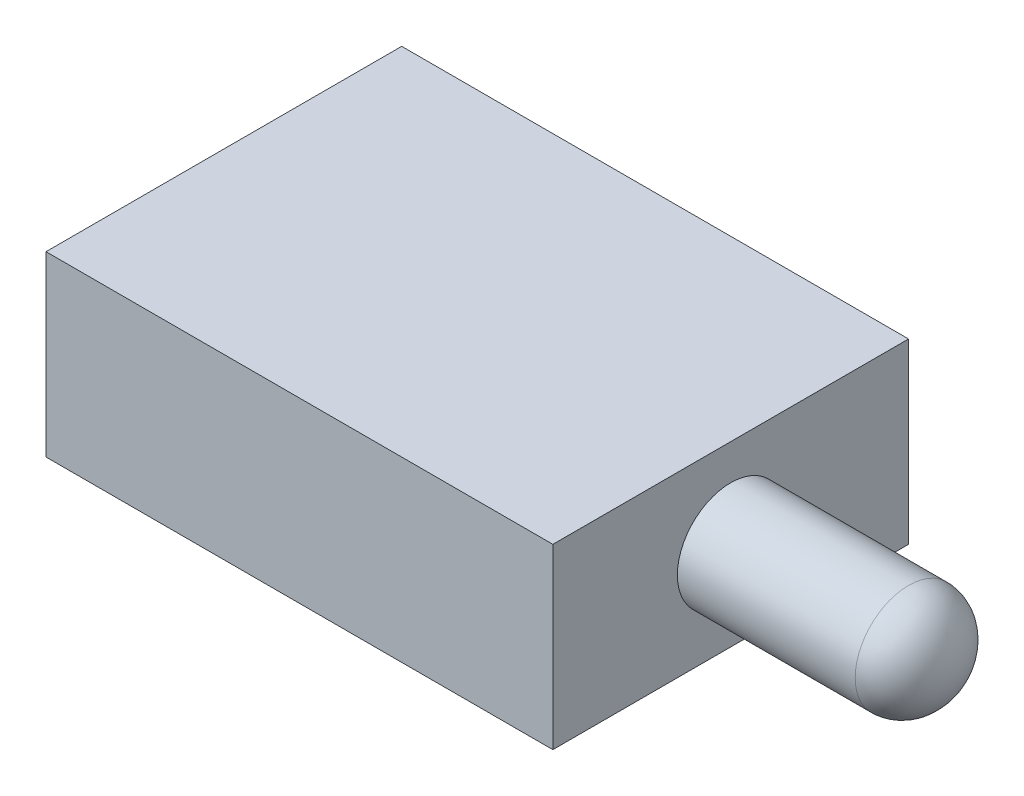
ISO-10303-21;
HEADER;
FILE_DESCRIPTION(('STEP AP214'),'2;1');
FILE_NAME('part.step','',(''),(''),'','','');
FILE_SCHEMA(('AUTOMOTIVE_DESIGN { 1 0 10303 214 1 1 1 1 }'));
ENDSEC;
DATA;
#1=APPLICATION_CONTEXT('core data for automotive mechanical design processes');
#2=APPLICATION_PROTOCOL_DEFINITION('international standard','automotive_design',2000,#1);
#3=PRODUCT_CONTEXT('',#1,'mechanical');
#4=PRODUCT('Part','Part','',(#3));
#5=PRODUCT_RELATED_PRODUCT_CATEGORY('part','',(#4));
#6=PRODUCT_DEFINITION_FORMATION('','',#4);
#7=PRODUCT_DEFINITION_CONTEXT('part definition',#1,'design');
#8=PRODUCT_DEFINITION('design','',#6,#7);
#9=PRODUCT_DEFINITION_SHAPE('','',#8);
#10=(LENGTH_UNIT() NAMED_UNIT(*) SI_UNIT(.MILLI.,.METRE.));
#11=(NAMED_UNIT(*) PLANE_ANGLE_UNIT() SI_UNIT($,.RADIAN.));
#12=(NAMED_UNIT(*) SI_UNIT($,.STERADIAN.) SOLID_ANGLE_UNIT());
#13=UNCERTAINTY_MEASURE_WITH_UNIT(LENGTH_MEASURE(1.E-05),#10,'distance_accuracy_value','');
#14=(GEOMETRIC_REPRESENTATION_CONTEXT(3) GLOBAL_UNCERTAINTY_ASSIGNED_CONTEXT((#13)) GLOBAL_UNIT_ASSIGNED_CONTEXT((#10,
#11,#12)) REPRESENTATION_CONTEXT('',''));
#15=CARTESIAN_POINT('',(0.,0.,0.));
#16=DIRECTION('',(0.,0.,1.));
#17=DIRECTION('',(1.,0.,0.));
#18=AXIS2_PLACEMENT_3D('',#15,#16,#17);
#19=CARTESIAN_POINT('',(0.,0.,0.));
#20=DIRECTION('',(0.,-1.,0.));
#21=DIRECTION('',(0.,0.,-1.));
#22=AXIS2_PLACEMENT_3D('',#19,#20,#21);
#23=PLANE('',#22);
#24=CARTESIAN_POINT('',(4.45,0.,0.));
#25=DIRECTION('',(0.,-1.,0.));
#26=DIRECTION('',(0.,0.,-1.));
#27=AXIS2_PLACEMENT_3D('',#24,#25,#26);
#28=CIRCLE('',#27,0.4);
#29=CARTESIAN_POINT('',(4.45,0.,-0.4));
#30=VERTEX_POINT('',#29);
#31=EDGE_CURVE('E122',#30,#30,#28,.T.);
#32=ORIENTED_EDGE('',*,*,#31,.F.);
#33=EDGE_LOOP('',(#32));
#34=FACE_BOUND('',#33,.T.);
#35=DIRECTION('',(0.,0.,1.));
#36=VECTOR('',#35,1.);
#37=CARTESIAN_POINT('',(0.,0.,2.));
#38=LINE('',#37,#36);
#39=CARTESIAN_POINT('',(0.,0.,-2.));
#40=VERTEX_POINT('',#39);
#41=CARTESIAN_POINT('',(0.,0.,2.));
#42=VERTEX_POINT('',#41);
#43=EDGE_CURVE('E107',#40,#42,#38,.T.);
#44=ORIENTED_EDGE('',*,*,#43,.F.);
#45=DIRECTION('',(-1.,0.,0.));
#46=VECTOR('',#45,1.);
#47=CARTESIAN_POINT('',(0.,0.,-2.));
#48=LINE('',#47,#46);
#49=CARTESIAN_POINT('',(5.7,0.,-2.));
#50=VERTEX_POINT('',#49);
#51=EDGE_CURVE('E75',#50,#40,#48,.T.);
#52=ORIENTED_EDGE('',*,*,#51,.F.);
#53=DIRECTION('',(0.,0.,-1.));
#54=VECTOR('',#53,1.);
#55=CARTESIAN_POINT('',(5.7,0.,2.));
#56=LINE('',#55,#54);
#57=CARTESIAN_POINT('',(5.7,0.,2.));
#58=VERTEX_POINT('',#57);
#59=EDGE_CURVE('E112',#58,#50,#56,.T.);
#60=ORIENTED_EDGE('',*,*,#59,.F.);
#61=DIRECTION('',(1.,0.,0.));
#62=VECTOR('',#61,1.);
#63=CARTESIAN_POINT('',(0.,0.,2.));
#64=LINE('',#63,#62);
#65=EDGE_CURVE('E95',#42,#58,#64,.T.);
#66=ORIENTED_EDGE('',*,*,#65,.F.);
#67=EDGE_LOOP('',(#44,#52,#60,#66));
#68=FACE_BOUND('',#67,.T.);
#69=CARTESIAN_POINT('',(1.45,0.,0.));
#70=DIRECTION('',(0.,-1.,0.));
#71=DIRECTION('',(0.,0.,-1.));
#72=AXIS2_PLACEMENT_3D('',#69,#70,#71);
#73=CIRCLE('',#72,0.4);
#74=CARTESIAN_POINT('',(1.45,0.,-0.4));
#75=VERTEX_POINT('',#74);
#76=EDGE_CURVE('E130',#75,#75,#73,.T.);
#77=ORIENTED_EDGE('',*,*,#76,.F.);
#78=EDGE_LOOP('',(#77));
#79=FACE_BOUND('',#78,.T.);
#80=ADVANCED_FACE('F34',(#34,#68,#79),#23,.T.);
#81=CARTESIAN_POINT('',(5.7,2.,2.));
#82=DIRECTION('',(-1.,0.,0.));
#83=DIRECTION('',(0.,0.,1.));
#84=AXIS2_PLACEMENT_3D('',#81,#82,#83);
#85=PLANE('',#84);
#86=ORIENTED_EDGE('',*,*,#59,.T.);
#87=DIRECTION('',(0.,-1.,0.));
#88=VECTOR('',#87,1.);
#89=CARTESIAN_POINT('',(5.7,2.,-2.));
#90=LINE('',#89,#88);
#91=CARTESIAN_POINT('',(5.7,2.,-2.));
#92=VERTEX_POINT('',#91);
#93=EDGE_CURVE('E98',#92,#50,#90,.T.);
#94=ORIENTED_EDGE('',*,*,#93,.F.);
#95=DIRECTION('',(0.,0.,-1.));
#96=VECTOR('',#95,1.);
#97=CARTESIAN_POINT('',(5.7,2.,2.));
#98=LINE('',#97,#96);
#99=CARTESIAN_POINT('',(5.7,2.,2.));
#100=VERTEX_POINT('',#99);
#101=EDGE_CURVE('E86',#100,#92,#98,.T.);
#102=ORIENTED_EDGE('',*,*,#101,.F.);
#103=DIRECTION('',(0.,-1.,0.));
#104=VECTOR('',#103,1.);
#105=CARTESIAN_POINT('',(5.7,2.,2.));
#106=LINE('',#105,#104);
#107=EDGE_CURVE('E93',#100,#58,#106,.T.);
#108=ORIENTED_EDGE('',*,*,#107,.T.);
#109=EDGE_LOOP('',(#86,#94,#102,#108));
#110=FACE_BOUND('',#109,.T.);
#111=CARTESIAN_POINT('',(5.7,1.,0.));
#112=DIRECTION('',(-1.,0.,0.));
#113=DIRECTION('',(0.,0.,1.));
#114=AXIS2_PLACEMENT_3D('',#111,#112,#113);
#115=CIRCLE('',#114,0.6);
#116=CARTESIAN_POINT('',(5.7,1.,0.599999999999999));
#117=VERTEX_POINT('',#116);
#118=EDGE_CURVE('E11',#117,#117,#115,.F.);
#119=ORIENTED_EDGE('',*,*,#118,.F.);
#120=EDGE_LOOP('',(#119));
#121=FACE_BOUND('',#120,.T.);
#122=ADVANCED_FACE('F100',(#110,#121),#85,.F.);
#123=CARTESIAN_POINT('',(0.,2.,2.));
#124=DIRECTION('',(1.,0.,0.));
#125=DIRECTION('',(0.,0.,-1.));
#126=AXIS2_PLACEMENT_3D('',#123,#124,#125);
#127=PLANE('',#126);
#128=ORIENTED_EDGE('',*,*,#43,.T.);
#129=DIRECTION('',(0.,-1.,0.));
#130=VECTOR('',#129,1.);
#131=CARTESIAN_POINT('',(0.,2.,2.));
#132=LINE('',#131,#130);
#133=CARTESIAN_POINT('',(0.,2.,2.));
#134=VERTEX_POINT('',#133);
#135=EDGE_CURVE('E43',#134,#42,#132,.T.);
#136=ORIENTED_EDGE('',*,*,#135,.F.);
#137=DIRECTION('',(0.,0.,1.));
#138=VECTOR('',#137,1.);
#139=CARTESIAN_POINT('',(0.,2.,2.));
#140=LINE('',#139,#138);
#141=CARTESIAN_POINT('',(0.,2.,-2.));
#142=VERTEX_POINT('',#141);
#143=EDGE_CURVE('E89',#142,#134,#140,.T.);
#144=ORIENTED_EDGE('',*,*,#143,.F.);
#145=DIRECTION('',(0.,-1.,0.));
#146=VECTOR('',#145,1.);
#147=CARTESIAN_POINT('',(0.,2.,-2.));
#148=LINE('',#147,#146);
#149=EDGE_CURVE('E103',#142,#40,#148,.T.);
#150=ORIENTED_EDGE('',*,*,#149,.T.);
#151=EDGE_LOOP('',(#128,#136,#144,#150));
#152=FACE_BOUND('',#151,.T.);
#153=ADVANCED_FACE('F151',(#152),#127,.F.);
#154=CARTESIAN_POINT('',(0.,2.,2.));
#155=DIRECTION('',(0.,0.,-1.));
#156=DIRECTION('',(-1.,0.,0.));
#157=AXIS2_PLACEMENT_3D('',#154,#155,#156);
#158=PLANE('',#157);
#159=ORIENTED_EDGE('',*,*,#65,.T.);
#160=ORIENTED_EDGE('',*,*,#107,.F.);
#161=DIRECTION('',(1.,0.,0.));
#162=VECTOR('',#161,1.);
#163=CARTESIAN_POINT('',(0.,2.,2.));
#164=LINE('',#163,#162);
#165=EDGE_CURVE('E83',#134,#100,#164,.T.);
#166=ORIENTED_EDGE('',*,*,#165,.F.);
#167=ORIENTED_EDGE('',*,*,#135,.T.);
#168=EDGE_LOOP('',(#159,#160,#166,#167));
#169=FACE_BOUND('',#168,.T.);
#170=ADVANCED_FACE('F94',(#169),#158,.F.);
#171=CARTESIAN_POINT('',(0.,2.,-2.));
#172=DIRECTION('',(0.,0.,1.));
#173=DIRECTION('',(1.,0.,0.));
#174=AXIS2_PLACEMENT_3D('',#171,#172,#173);
#175=PLANE('',#174);
#176=ORIENTED_EDGE('',*,*,#51,.T.);
#177=ORIENTED_EDGE('',*,*,#149,.F.);
#178=DIRECTION('',(-1.,0.,0.));
#179=VECTOR('',#178,1.);
#180=CARTESIAN_POINT('',(0.,2.,-2.));
#181=LINE('',#180,#179);
#182=EDGE_CURVE('E55',#92,#142,#181,.T.);
#183=ORIENTED_EDGE('',*,*,#182,.F.);
#184=ORIENTED_EDGE('',*,*,#93,.T.);
#185=EDGE_LOOP('',(#176,#177,#183,#184));
#186=FACE_BOUND('',#185,.T.);
#187=ADVANCED_FACE('F158',(#186),#175,.F.);
#188=CARTESIAN_POINT('',(0.,2.,0.));
#189=DIRECTION('',(0.,-1.,0.));
#190=DIRECTION('',(0.,0.,-1.));
#191=AXIS2_PLACEMENT_3D('',#188,#189,#190);
#192=PLANE('',#191);
#193=ORIENTED_EDGE('',*,*,#143,.T.);
#194=ORIENTED_EDGE('',*,*,#165,.T.);
#195=ORIENTED_EDGE('',*,*,#101,.T.);
#196=ORIENTED_EDGE('',*,*,#182,.T.);
#197=EDGE_LOOP('',(#193,#194,#195,#196));
#198=FACE_BOUND('',#197,.T.);
#199=ADVANCED_FACE('F84',(#198),#192,.F.);
#200=CARTESIAN_POINT('',(7.7,1.,0.));
#201=DIRECTION('',(-1.,0.,0.));
#202=DIRECTION('',(0.,0.,1.));
#203=AXIS2_PLACEMENT_3D('',#200,#201,#202);
#204=CYLINDRICAL_SURFACE('',#203,0.6);
#205=CARTESIAN_POINT('',(7.7,1.,0.));
#206=DIRECTION('',(1.,0.,0.));
#207=DIRECTION('',(0.,0.,-1.));
#208=AXIS2_PLACEMENT_3D('',#205,#206,#207);
#209=CIRCLE('',#208,0.6);
#210=CARTESIAN_POINT('',(7.7,1.,-0.600000000000001));
#211=VERTEX_POINT('',#210);
#212=EDGE_CURVE('E110',#211,#211,#209,.T.);
#213=ORIENTED_EDGE('',*,*,#212,.F.);
#214=EDGE_LOOP('',(#213));
#215=FACE_BOUND('',#214,.T.);
#216=ORIENTED_EDGE('',*,*,#118,.T.);
#217=EDGE_LOOP('',(#216));
#218=FACE_BOUND('',#217,.T.);
#219=ADVANCED_FACE('F183',(#215,#218),#204,.T.);
#220=CARTESIAN_POINT('',(7.7,1.,0.));
#221=DIRECTION('',(0.,1.,0.));
#222=DIRECTION('',(0.,0.,-1.));
#223=AXIS2_PLACEMENT_3D('',#220,#221,#222);
#224=ELLIPSE('',#223,0.6,0.5);
#225=TRIMMED_CURVE('',#224,(PARAMETER_VALUE(4.71238898038469)),
(PARAMETER_VALUE(7.85398163397448)),.T.,.PARAMETER.);
#226=CARTESIAN_POINT('',(7.2,1.,0.));
#227=DIRECTION('',(1.,0.,0.));
#228=AXIS1_PLACEMENT('',#226,#227);
#229=SURFACE_OF_REVOLUTION('',#225,#228);
#230=CARTESIAN_POINT('',(8.2,1.,0.));
#231=VERTEX_POINT('',#230);
#232=VERTEX_LOOP('',#231);
#233=FACE_BOUND('',#232,.T.);
#234=ORIENTED_EDGE('',*,*,#212,.T.);
#235=EDGE_LOOP('',(#234));
#236=FACE_BOUND('',#235,.T.);
#237=ADVANCED_FACE('F36',(#233,#236),#229,.F.);
#238=CARTESIAN_POINT('',(4.45,-0.6,0.));
#239=DIRECTION('',(0.,1.,0.));
#240=DIRECTION('',(0.,0.,1.));
#241=AXIS2_PLACEMENT_3D('',#238,#239,#240);
#242=CYLINDRICAL_SURFACE('',#241,0.4);
#243=CARTESIAN_POINT('',(4.45,-0.6,0.));
#244=DIRECTION('',(0.,-1.,0.));
#245=DIRECTION('',(0.,0.,-1.));
#246=AXIS2_PLACEMENT_3D('',#243,#244,#245);
#247=CIRCLE('',#246,0.4);
#248=CARTESIAN_POINT('',(4.45,-0.6,-0.4));
#249=VERTEX_POINT('',#248);
#250=EDGE_CURVE('E118',#249,#249,#247,.T.);
#251=ORIENTED_EDGE('',*,*,#250,.F.);
#252=EDGE_LOOP('',(#251));
#253=FACE_BOUND('',#252,.T.);
#254=ORIENTED_EDGE('',*,*,#31,.T.);
#255=EDGE_LOOP('',(#254));
#256=FACE_BOUND('',#255,.T.);
#257=ADVANCED_FACE('F195',(#253,#256),#242,.T.);
#258=CARTESIAN_POINT('',(4.45,-0.6,0.));
#259=DIRECTION('',(0.,-1.,0.));
#260=DIRECTION('',(0.,0.,-1.));
#261=AXIS2_PLACEMENT_3D('',#258,#259,#260);
#262=PLANE('',#261);
#263=ORIENTED_EDGE('',*,*,#250,.T.);
#264=EDGE_LOOP('',(#263));
#265=FACE_BOUND('',#264,.T.);
#266=ADVANCED_FACE('F141',(#265),#262,.T.);
#267=CARTESIAN_POINT('',(1.45,-0.6,0.));
#268=DIRECTION('',(0.,1.,0.));
#269=DIRECTION('',(0.,0.,1.));
#270=AXIS2_PLACEMENT_3D('',#267,#268,#269);
#271=CYLINDRICAL_SURFACE('',#270,0.4);
#272=CARTESIAN_POINT('',(1.45,-0.6,0.));
#273=DIRECTION('',(0.,-1.,0.));
#274=DIRECTION('',(0.,0.,-1.));
#275=AXIS2_PLACEMENT_3D('',#272,#273,#274);
#276=CIRCLE('',#275,0.4);
#277=CARTESIAN_POINT('',(1.45,-0.6,-0.4));
#278=VERTEX_POINT('',#277);
#279=EDGE_CURVE('E127',#278,#278,#276,.T.);
#280=ORIENTED_EDGE('',*,*,#279,.F.);
#281=EDGE_LOOP('',(#280));
#282=FACE_BOUND('',#281,.T.);
#283=ORIENTED_EDGE('',*,*,#76,.T.);
#284=EDGE_LOOP('',(#283));
#285=FACE_BOUND('',#284,.T.);
#286=ADVANCED_FACE('F138',(#282,#285),#271,.T.);
#287=CARTESIAN_POINT('',(1.45,-0.6,0.));
#288=DIRECTION('',(0.,-1.,0.));
#289=DIRECTION('',(0.,0.,-1.));
#290=AXIS2_PLACEMENT_3D('',#287,#288,#289);
#291=PLANE('',#290);
#292=ORIENTED_EDGE('',*,*,#279,.T.);
#293=EDGE_LOOP('',(#292));
#294=FACE_BOUND('',#293,.T.);
#295=ADVANCED_FACE('F136',(#294),#291,.T.);
#296=CLOSED_SHELL('',(#80,#122,#153,#170,#187,#199,#219,#237,#257,#266,#286,#295));
#297=MANIFOLD_SOLID_BREP('B2',#296);
#298=ADVANCED_BREP_SHAPE_REPRESENTATION('',(#18,#297),#14);
#299=SHAPE_DEFINITION_REPRESENTATION(#9,#298);
ENDSEC;
END-ISO-10303-21;
